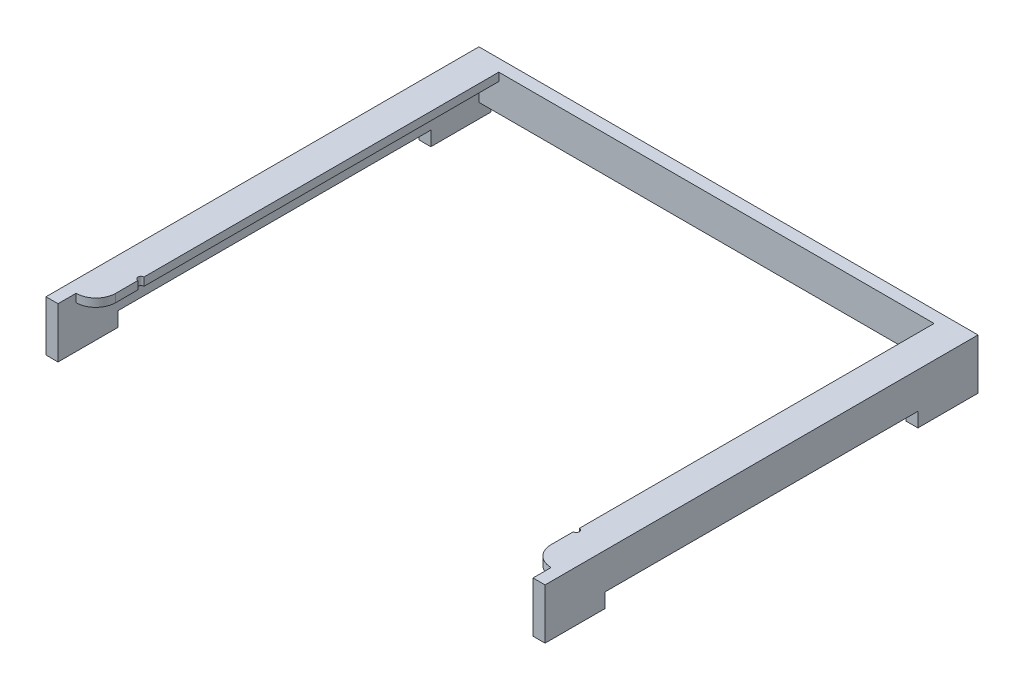
ISO-10303-21;
HEADER;
FILE_DESCRIPTION(('STEP AP214'),'2;1');
FILE_NAME('part.step','',(''),(''),'','','');
FILE_SCHEMA(('AUTOMOTIVE_DESIGN { 1 0 10303 214 1 1 1 1 }'));
ENDSEC;
DATA;
#1=APPLICATION_CONTEXT('core data for automotive mechanical design processes');
#2=APPLICATION_PROTOCOL_DEFINITION('international standard','automotive_design',2000,#1);
#3=PRODUCT_CONTEXT('',#1,'mechanical');
#4=PRODUCT('Part','Part','',(#3));
#5=PRODUCT_RELATED_PRODUCT_CATEGORY('part','',(#4));
#6=PRODUCT_DEFINITION_FORMATION('','',#4);
#7=PRODUCT_DEFINITION_CONTEXT('part definition',#1,'design');
#8=PRODUCT_DEFINITION('design','',#6,#7);
#9=PRODUCT_DEFINITION_SHAPE('','',#8);
#10=(LENGTH_UNIT() NAMED_UNIT(*) SI_UNIT(.MILLI.,.METRE.));
#11=(NAMED_UNIT(*) PLANE_ANGLE_UNIT() SI_UNIT($,.RADIAN.));
#12=(NAMED_UNIT(*) SI_UNIT($,.STERADIAN.) SOLID_ANGLE_UNIT());
#13=UNCERTAINTY_MEASURE_WITH_UNIT(LENGTH_MEASURE(1.E-05),#10,'distance_accuracy_value','');
#14=(GEOMETRIC_REPRESENTATION_CONTEXT(3) GLOBAL_UNCERTAINTY_ASSIGNED_CONTEXT((#13)) GLOBAL_UNIT_ASSIGNED_CONTEXT((#10,
#11,#12)) REPRESENTATION_CONTEXT('',''));
#15=CARTESIAN_POINT('',(0.,0.,0.));
#16=DIRECTION('',(0.,0.,1.));
#17=DIRECTION('',(1.,0.,0.));
#18=AXIS2_PLACEMENT_3D('',#15,#16,#17);
#19=CARTESIAN_POINT('',(0.,0.,0.));
#20=DIRECTION('',(0.,-1.,0.));
#21=DIRECTION('',(0.,0.,-1.));
#22=AXIS2_PLACEMENT_3D('',#19,#20,#21);
#23=PLANE('',#22);
#24=DIRECTION('',(1.,0.,0.));
#25=VECTOR('',#24,1.);
#26=CARTESIAN_POINT('',(83.,0.,-62.));
#27=LINE('',#26,#25);
#28=CARTESIAN_POINT('',(81.,0.,-62.));
#29=VERTEX_POINT('',#28);
#30=CARTESIAN_POINT('',(83.,0.,-62.));
#31=VERTEX_POINT('',#30);
#32=EDGE_CURVE('E303',#29,#31,#27,.T.);
#33=ORIENTED_EDGE('',*,*,#32,.T.);
#34=DIRECTION('',(0.,0.,-1.));
#35=VECTOR('',#34,1.);
#36=CARTESIAN_POINT('',(83.,0.,-72.));
#37=LINE('',#36,#35);
#38=CARTESIAN_POINT('',(83.,0.,-10.));
#39=VERTEX_POINT('',#38);
#40=EDGE_CURVE('E274',#39,#31,#37,.T.);
#41=ORIENTED_EDGE('',*,*,#40,.F.);
#42=DIRECTION('',(-1.,0.,0.));
#43=VECTOR('',#42,1.);
#44=CARTESIAN_POINT('',(83.,0.,-10.));
#45=LINE('',#44,#43);
#46=CARTESIAN_POINT('',(81.,0.,-10.));
#47=VERTEX_POINT('',#46);
#48=EDGE_CURVE('E69',#39,#47,#45,.T.);
#49=ORIENTED_EDGE('',*,*,#48,.T.);
#50=DIRECTION('',(0.,0.,1.));
#51=VECTOR('',#50,1.);
#52=CARTESIAN_POINT('',(81.,0.,0.));
#53=LINE('',#52,#51);
#54=EDGE_CURVE('E528',#29,#47,#53,.T.);
#55=ORIENTED_EDGE('',*,*,#54,.F.);
#56=EDGE_LOOP('',(#33,#41,#49,#55));
#57=FACE_BOUND('',#56,.T.);
#58=ADVANCED_FACE('F40',(#57),#23,.T.);
#59=CARTESIAN_POINT('',(81.,6.,-70.));
#60=DIRECTION('',(0.,0.,-1.));
#61=DIRECTION('',(-1.,0.,0.));
#62=AXIS2_PLACEMENT_3D('',#59,#60,#61);
#63=PLANE('',#62);
#64=DIRECTION('',(0.,1.,0.));
#65=VECTOR('',#64,1.);
#66=CARTESIAN_POINT('',(77.7,4.65,-70.));
#67=LINE('',#66,#65);
#68=CARTESIAN_POINT('',(77.7,4.65,-70.));
#69=VERTEX_POINT('',#68);
#70=CARTESIAN_POINT('',(77.7,6.,-70.));
#71=VERTEX_POINT('',#70);
#72=EDGE_CURVE('E377',#69,#71,#67,.T.);
#73=ORIENTED_EDGE('',*,*,#72,.T.);
#74=DIRECTION('',(1.,0.,0.));
#75=VECTOR('',#74,1.);
#76=CARTESIAN_POINT('',(81.,6.,-70.));
#77=LINE('',#76,#75);
#78=CARTESIAN_POINT('',(5.3,6.,-70.));
#79=VERTEX_POINT('',#78);
#80=EDGE_CURVE('E502',#79,#71,#77,.T.);
#81=ORIENTED_EDGE('',*,*,#80,.F.);
#82=DIRECTION('',(0.,1.,0.));
#83=VECTOR('',#82,1.);
#84=CARTESIAN_POINT('',(5.3,4.65,-70.));
#85=LINE('',#84,#83);
#86=CARTESIAN_POINT('',(5.3,4.65,-70.));
#87=VERTEX_POINT('',#86);
#88=EDGE_CURVE('E481',#87,#79,#85,.T.);
#89=ORIENTED_EDGE('',*,*,#88,.F.);
#90=DIRECTION('',(-1.,0.,0.));
#91=VECTOR('',#90,1.);
#92=CARTESIAN_POINT('',(2.,4.65,-70.));
#93=LINE('',#92,#91);
#94=CARTESIAN_POINT('',(2.,4.65,-70.));
#95=VERTEX_POINT('',#94);
#96=EDGE_CURVE('E454',#87,#95,#93,.T.);
#97=ORIENTED_EDGE('',*,*,#96,.T.);
#98=DIRECTION('',(0.,-1.,0.));
#99=VECTOR('',#98,1.);
#100=CARTESIAN_POINT('',(2.,6.,-70.));
#101=LINE('',#100,#99);
#102=CARTESIAN_POINT('',(2.,0.,-70.));
#103=VERTEX_POINT('',#102);
#104=EDGE_CURVE('E49',#95,#103,#101,.T.);
#105=ORIENTED_EDGE('',*,*,#104,.T.);
#106=DIRECTION('',(1.,0.,0.));
#107=VECTOR('',#106,1.);
#108=CARTESIAN_POINT('',(81.,0.,-70.));
#109=LINE('',#108,#107);
#110=CARTESIAN_POINT('',(81.,0.,-70.));
#111=VERTEX_POINT('',#110);
#112=EDGE_CURVE('E524',#103,#111,#109,.T.);
#113=ORIENTED_EDGE('',*,*,#112,.T.);
#114=DIRECTION('',(0.,-1.,0.));
#115=VECTOR('',#114,1.);
#116=CARTESIAN_POINT('',(81.,6.,-70.));
#117=LINE('',#116,#115);
#118=CARTESIAN_POINT('',(81.,4.65,-70.));
#119=VERTEX_POINT('',#118);
#120=EDGE_CURVE('E549',#119,#111,#117,.T.);
#121=ORIENTED_EDGE('',*,*,#120,.F.);
#122=DIRECTION('',(1.,0.,0.));
#123=VECTOR('',#122,1.);
#124=CARTESIAN_POINT('',(81.,4.65,-70.));
#125=LINE('',#124,#123);
#126=EDGE_CURVE('E341',#69,#119,#125,.T.);
#127=ORIENTED_EDGE('',*,*,#126,.F.);
#128=EDGE_LOOP('',(#73,#81,#89,#97,#105,#113,#121,#127));
#129=FACE_BOUND('',#128,.T.);
#130=ADVANCED_FACE('F555',(#129),#63,.F.);
#131=CARTESIAN_POINT('',(81.,6.,0.));
#132=DIRECTION('',(1.,0.,0.));
#133=DIRECTION('',(0.,0.,-1.));
#134=AXIS2_PLACEMENT_3D('',#131,#132,#133);
#135=PLANE('',#134);
#136=DIRECTION('',(0.,1.,0.));
#137=VECTOR('',#136,1.);
#138=CARTESIAN_POINT('',(81.,4.65,-3.));
#139=LINE('',#138,#137);
#140=CARTESIAN_POINT('',(81.,4.65,-3.));
#141=VERTEX_POINT('',#140);
#142=CARTESIAN_POINT('',(81.,6.,-3.));
#143=VERTEX_POINT('',#142);
#144=EDGE_CURVE('E353',#141,#143,#139,.T.);
#145=ORIENTED_EDGE('',*,*,#144,.F.);
#146=DIRECTION('',(0.,0.,1.));
#147=VECTOR('',#146,1.);
#148=CARTESIAN_POINT('',(81.,4.65,-3.));
#149=LINE('',#148,#147);
#150=EDGE_CURVE('E337',#119,#141,#149,.T.);
#151=ORIENTED_EDGE('',*,*,#150,.F.);
#152=ORIENTED_EDGE('',*,*,#120,.T.);
#153=DIRECTION('',(0.,0.,1.));
#154=VECTOR('',#153,1.);
#155=CARTESIAN_POINT('',(81.,0.,-72.));
#156=LINE('',#155,#154);
#157=CARTESIAN_POINT('',(81.,0.,-72.));
#158=VERTEX_POINT('',#157);
#159=EDGE_CURVE('E59',#158,#111,#156,.T.);
#160=ORIENTED_EDGE('',*,*,#159,.F.);
#161=DIRECTION('',(0.,1.,0.));
#162=VECTOR('',#161,1.);
#163=CARTESIAN_POINT('',(81.,-2.4,-72.));
#164=LINE('',#163,#162);
#165=CARTESIAN_POINT('',(81.,-2.4,-72.));
#166=VERTEX_POINT('',#165);
#167=EDGE_CURVE('E302',#166,#158,#164,.T.);
#168=ORIENTED_EDGE('',*,*,#167,.F.);
#169=DIRECTION('',(0.,0.,1.));
#170=VECTOR('',#169,1.);
#171=CARTESIAN_POINT('',(81.,-2.4,-72.));
#172=LINE('',#171,#170);
#173=CARTESIAN_POINT('',(81.,-2.4,-62.));
#174=VERTEX_POINT('',#173);
#175=EDGE_CURVE('E294',#166,#174,#172,.T.);
#176=ORIENTED_EDGE('',*,*,#175,.T.);
#177=DIRECTION('',(0.,1.,0.));
#178=VECTOR('',#177,1.);
#179=CARTESIAN_POINT('',(81.,-2.4,-62.));
#180=LINE('',#179,#178);
#181=EDGE_CURVE('E280',#174,#29,#180,.T.);
#182=ORIENTED_EDGE('',*,*,#181,.T.);
#183=ORIENTED_EDGE('',*,*,#54,.T.);
#184=DIRECTION('',(0.,1.,0.));
#185=VECTOR('',#184,1.);
#186=CARTESIAN_POINT('',(81.,-2.4,-10.));
#187=LINE('',#186,#185);
#188=CARTESIAN_POINT('',(81.,-2.4,-10.));
#189=VERTEX_POINT('',#188);
#190=EDGE_CURVE('E329',#189,#47,#187,.T.);
#191=ORIENTED_EDGE('',*,*,#190,.F.);
#192=DIRECTION('',(0.,0.,1.));
#193=VECTOR('',#192,1.);
#194=CARTESIAN_POINT('',(81.,-2.4,0.));
#195=LINE('',#194,#193);
#196=CARTESIAN_POINT('',(81.,-2.4,0.));
#197=VERTEX_POINT('',#196);
#198=EDGE_CURVE('E318',#189,#197,#195,.T.);
#199=ORIENTED_EDGE('',*,*,#198,.T.);
#200=DIRECTION('',(0.,-1.,0.));
#201=VECTOR('',#200,1.);
#202=CARTESIAN_POINT('',(81.,6.,0.));
#203=LINE('',#202,#201);
#204=CARTESIAN_POINT('',(81.,6.,0.));
#205=VERTEX_POINT('',#204);
#206=EDGE_CURVE('E547',#205,#197,#203,.T.);
#207=ORIENTED_EDGE('',*,*,#206,.F.);
#208=DIRECTION('',(0.,0.,1.));
#209=VECTOR('',#208,1.);
#210=CARTESIAN_POINT('',(81.,6.,0.));
#211=LINE('',#210,#209);
#212=EDGE_CURVE('E506',#143,#205,#211,.T.);
#213=ORIENTED_EDGE('',*,*,#212,.F.);
#214=EDGE_LOOP('',(#145,#151,#152,#160,#168,#176,#182,#183,#191,#199,#207,#213));
#215=FACE_BOUND('',#214,.T.);
#216=ADVANCED_FACE('F565',(#215),#135,.F.);
#217=ORIENTED_EDGE('',*,*,#159,.T.);
#218=ORIENTED_EDGE('',*,*,#112,.F.);
#219=DIRECTION('',(0.,0.,1.));
#220=VECTOR('',#219,1.);
#221=CARTESIAN_POINT('',(2.,0.,-72.));
#222=LINE('',#221,#220);
#223=CARTESIAN_POINT('',(2.,0.,-72.));
#224=VERTEX_POINT('',#223);
#225=EDGE_CURVE('E368',#224,#103,#222,.T.);
#226=ORIENTED_EDGE('',*,*,#225,.F.);
#227=DIRECTION('',(-1.,0.,0.));
#228=VECTOR('',#227,1.);
#229=CARTESIAN_POINT('',(0.,0.,-72.));
#230=LINE('',#229,#228);
#231=EDGE_CURVE('E533',#158,#224,#230,.T.);
#232=ORIENTED_EDGE('',*,*,#231,.F.);
#233=EDGE_LOOP('',(#217,#218,#226,#232));
#234=FACE_BOUND('',#233,.T.);
#235=ADVANCED_FACE('F561',(#234),#23,.T.);
#236=DIRECTION('',(0.,0.,1.));
#237=VECTOR('',#236,1.);
#238=CARTESIAN_POINT('',(0.,0.,0.));
#239=LINE('',#238,#237);
#240=CARTESIAN_POINT('',(0.,0.,-62.));
#241=VERTEX_POINT('',#240);
#242=CARTESIAN_POINT('',(0.,0.,-10.));
#243=VERTEX_POINT('',#242);
#244=EDGE_CURVE('E498',#241,#243,#239,.T.);
#245=ORIENTED_EDGE('',*,*,#244,.F.);
#246=DIRECTION('',(-1.,0.,0.));
#247=VECTOR('',#246,1.);
#248=CARTESIAN_POINT('',(0.,0.,-62.));
#249=LINE('',#248,#247);
#250=CARTESIAN_POINT('',(2.,0.,-62.));
#251=VERTEX_POINT('',#250);
#252=EDGE_CURVE('E389',#251,#241,#249,.T.);
#253=ORIENTED_EDGE('',*,*,#252,.F.);
#254=DIRECTION('',(0.,0.,-1.));
#255=VECTOR('',#254,1.);
#256=CARTESIAN_POINT('',(2.,0.,-70.));
#257=LINE('',#256,#255);
#258=CARTESIAN_POINT('',(2.,0.,-10.));
#259=VERTEX_POINT('',#258);
#260=EDGE_CURVE('E480',#259,#251,#257,.T.);
#261=ORIENTED_EDGE('',*,*,#260,.F.);
#262=DIRECTION('',(1.,0.,0.));
#263=VECTOR('',#262,1.);
#264=CARTESIAN_POINT('',(0.,0.,-10.));
#265=LINE('',#264,#263);
#266=EDGE_CURVE('E409',#243,#259,#265,.T.);
#267=ORIENTED_EDGE('',*,*,#266,.F.);
#268=EDGE_LOOP('',(#245,#253,#261,#267));
#269=FACE_BOUND('',#268,.T.);
#270=ADVANCED_FACE('F620',(#269),#23,.T.);
#271=CARTESIAN_POINT('',(2.,6.,0.));
#272=DIRECTION('',(0.,0.,-1.));
#273=DIRECTION('',(-1.,0.,0.));
#274=AXIS2_PLACEMENT_3D('',#271,#272,#273);
#275=PLANE('',#274);
#276=DIRECTION('',(0.,-1.,0.));
#277=VECTOR('',#276,1.);
#278=CARTESIAN_POINT('',(0.,6.,0.));
#279=LINE('',#278,#277);
#280=CARTESIAN_POINT('',(0.,6.,0.));
#281=VERTEX_POINT('',#280);
#282=CARTESIAN_POINT('',(0.,-2.4,0.));
#283=VERTEX_POINT('',#282);
#284=EDGE_CURVE('E520',#281,#283,#279,.T.);
#285=ORIENTED_EDGE('',*,*,#284,.T.);
#286=DIRECTION('',(-1.,0.,0.));
#287=VECTOR('',#286,1.);
#288=CARTESIAN_POINT('',(0.,-2.4,0.));
#289=LINE('',#288,#287);
#290=CARTESIAN_POINT('',(2.,-2.4,0.));
#291=VERTEX_POINT('',#290);
#292=EDGE_CURVE('E421',#291,#283,#289,.T.);
#293=ORIENTED_EDGE('',*,*,#292,.F.);
#294=DIRECTION('',(0.,-1.,0.));
#295=VECTOR('',#294,1.);
#296=CARTESIAN_POINT('',(2.,6.,0.));
#297=LINE('',#296,#295);
#298=CARTESIAN_POINT('',(2.,6.,0.));
#299=VERTEX_POINT('',#298);
#300=EDGE_CURVE('E11',#299,#291,#297,.T.);
#301=ORIENTED_EDGE('',*,*,#300,.F.);
#302=DIRECTION('',(1.,0.,0.));
#303=VECTOR('',#302,1.);
#304=CARTESIAN_POINT('',(2.,6.,0.));
#305=LINE('',#304,#303);
#306=EDGE_CURVE('E493',#281,#299,#305,.T.);
#307=ORIENTED_EDGE('',*,*,#306,.F.);
#308=EDGE_LOOP('',(#285,#293,#301,#307));
#309=FACE_BOUND('',#308,.T.);
#310=ADVANCED_FACE('F42',(#309),#275,.F.);
#311=CARTESIAN_POINT('',(2.,6.,-70.));
#312=DIRECTION('',(-1.,0.,0.));
#313=DIRECTION('',(0.,0.,1.));
#314=AXIS2_PLACEMENT_3D('',#311,#312,#313);
#315=PLANE('',#314);
#316=DIRECTION('',(0.,0.,1.));
#317=VECTOR('',#316,1.);
#318=CARTESIAN_POINT('',(2.,4.65,-3.));
#319=LINE('',#318,#317);
#320=CARTESIAN_POINT('',(2.,4.65,-3.));
#321=VERTEX_POINT('',#320);
#322=EDGE_CURVE('E458',#95,#321,#319,.T.);
#323=ORIENTED_EDGE('',*,*,#322,.T.);
#324=DIRECTION('',(0.,1.,0.));
#325=VECTOR('',#324,1.);
#326=CARTESIAN_POINT('',(2.,4.65,-3.));
#327=LINE('',#326,#325);
#328=CARTESIAN_POINT('',(2.,6.,-3.));
#329=VERTEX_POINT('',#328);
#330=EDGE_CURVE('E476',#321,#329,#327,.T.);
#331=ORIENTED_EDGE('',*,*,#330,.T.);
#332=DIRECTION('',(0.,0.,-1.));
#333=VECTOR('',#332,1.);
#334=CARTESIAN_POINT('',(2.,6.,-70.));
#335=LINE('',#334,#333);
#336=EDGE_CURVE('E497',#299,#329,#335,.T.);
#337=ORIENTED_EDGE('',*,*,#336,.F.);
#338=ORIENTED_EDGE('',*,*,#300,.T.);
#339=DIRECTION('',(0.,0.,1.));
#340=VECTOR('',#339,1.);
#341=CARTESIAN_POINT('',(2.,-2.4,0.));
#342=LINE('',#341,#340);
#343=CARTESIAN_POINT('',(2.,-2.4,-10.));
#344=VERTEX_POINT('',#343);
#345=EDGE_CURVE('E417',#344,#291,#342,.T.);
#346=ORIENTED_EDGE('',*,*,#345,.F.);
#347=DIRECTION('',(0.,1.,0.));
#348=VECTOR('',#347,1.);
#349=CARTESIAN_POINT('',(2.,-2.4,-10.));
#350=LINE('',#349,#348);
#351=EDGE_CURVE('E425',#344,#259,#350,.T.);
#352=ORIENTED_EDGE('',*,*,#351,.T.);
#353=ORIENTED_EDGE('',*,*,#260,.T.);
#354=DIRECTION('',(0.,1.,0.));
#355=VECTOR('',#354,1.);
#356=CARTESIAN_POINT('',(2.,-2.4,-62.));
#357=LINE('',#356,#355);
#358=CARTESIAN_POINT('',(2.,-2.4,-62.));
#359=VERTEX_POINT('',#358);
#360=EDGE_CURVE('E403',#359,#251,#357,.T.);
#361=ORIENTED_EDGE('',*,*,#360,.F.);
#362=DIRECTION('',(0.,0.,1.));
#363=VECTOR('',#362,1.);
#364=CARTESIAN_POINT('',(2.,-2.4,-72.));
#365=LINE('',#364,#363);
#366=CARTESIAN_POINT('',(2.,-2.4,-72.));
#367=VERTEX_POINT('',#366);
#368=EDGE_CURVE('E391',#367,#359,#365,.T.);
#369=ORIENTED_EDGE('',*,*,#368,.F.);
#370=DIRECTION('',(0.,1.,0.));
#371=VECTOR('',#370,1.);
#372=CARTESIAN_POINT('',(2.,-2.4,-72.));
#373=LINE('',#372,#371);
#374=EDGE_CURVE('E406',#367,#224,#373,.T.);
#375=ORIENTED_EDGE('',*,*,#374,.T.);
#376=ORIENTED_EDGE('',*,*,#225,.T.);
#377=ORIENTED_EDGE('',*,*,#104,.F.);
#378=EDGE_LOOP('',(#323,#331,#337,#338,#346,#352,#353,#361,#369,#375,#376,#377));
#379=FACE_BOUND('',#378,.T.);
#380=ADVANCED_FACE('F598',(#379),#315,.F.);
#381=CARTESIAN_POINT('',(83.,6.,0.));
#382=DIRECTION('',(0.,0.,-1.));
#383=DIRECTION('',(-1.,0.,0.));
#384=AXIS2_PLACEMENT_3D('',#381,#382,#383);
#385=PLANE('',#384);
#386=ORIENTED_EDGE('',*,*,#206,.T.);
#387=DIRECTION('',(1.,0.,0.));
#388=VECTOR('',#387,1.);
#389=CARTESIAN_POINT('',(83.,-2.4,0.));
#390=LINE('',#389,#388);
#391=CARTESIAN_POINT('',(83.,-2.4,0.));
#392=VERTEX_POINT('',#391);
#393=EDGE_CURVE('E315',#197,#392,#390,.T.);
#394=ORIENTED_EDGE('',*,*,#393,.T.);
#395=DIRECTION('',(0.,-1.,0.));
#396=VECTOR('',#395,1.);
#397=CARTESIAN_POINT('',(83.,6.,0.));
#398=LINE('',#397,#396);
#399=CARTESIAN_POINT('',(83.,6.,0.));
#400=VERTEX_POINT('',#399);
#401=EDGE_CURVE('E545',#400,#392,#398,.T.);
#402=ORIENTED_EDGE('',*,*,#401,.F.);
#403=DIRECTION('',(1.,0.,0.));
#404=VECTOR('',#403,1.);
#405=CARTESIAN_POINT('',(83.,6.,0.));
#406=LINE('',#405,#404);
#407=EDGE_CURVE('E509',#205,#400,#406,.T.);
#408=ORIENTED_EDGE('',*,*,#407,.F.);
#409=EDGE_LOOP('',(#386,#394,#402,#408));
#410=FACE_BOUND('',#409,.T.);
#411=ADVANCED_FACE('F653',(#410),#385,.F.);
#412=CARTESIAN_POINT('',(83.,6.,-72.));
#413=DIRECTION('',(-1.,0.,0.));
#414=DIRECTION('',(0.,0.,1.));
#415=AXIS2_PLACEMENT_3D('',#412,#413,#414);
#416=PLANE('',#415);
#417=ORIENTED_EDGE('',*,*,#401,.T.);
#418=DIRECTION('',(0.,0.,-1.));
#419=VECTOR('',#418,1.);
#420=CARTESIAN_POINT('',(83.,-2.4,0.));
#421=LINE('',#420,#419);
#422=CARTESIAN_POINT('',(83.,-2.4,-10.));
#423=VERTEX_POINT('',#422);
#424=EDGE_CURVE('E312',#392,#423,#421,.T.);
#425=ORIENTED_EDGE('',*,*,#424,.T.);
#426=DIRECTION('',(0.,1.,0.));
#427=VECTOR('',#426,1.);
#428=CARTESIAN_POINT('',(83.,-2.4,-10.));
#429=LINE('',#428,#427);
#430=EDGE_CURVE('E324',#423,#39,#429,.T.);
#431=ORIENTED_EDGE('',*,*,#430,.T.);
#432=ORIENTED_EDGE('',*,*,#40,.T.);
#433=DIRECTION('',(0.,1.,0.));
#434=VECTOR('',#433,1.);
#435=CARTESIAN_POINT('',(83.,-2.4,-62.));
#436=LINE('',#435,#434);
#437=CARTESIAN_POINT('',(83.,-2.4,-62.));
#438=VERTEX_POINT('',#437);
#439=EDGE_CURVE('E267',#438,#31,#436,.T.);
#440=ORIENTED_EDGE('',*,*,#439,.F.);
#441=DIRECTION('',(0.,0.,-1.));
#442=VECTOR('',#441,1.);
#443=CARTESIAN_POINT('',(83.,-2.4,-72.));
#444=LINE('',#443,#442);
#445=CARTESIAN_POINT('',(83.,-2.4,-72.));
#446=VERTEX_POINT('',#445);
#447=EDGE_CURVE('E271',#438,#446,#444,.T.);
#448=ORIENTED_EDGE('',*,*,#447,.T.);
#449=DIRECTION('',(0.,-1.,0.));
#450=VECTOR('',#449,1.);
#451=CARTESIAN_POINT('',(83.,6.,-72.));
#452=LINE('',#451,#450);
#453=CARTESIAN_POINT('',(83.,6.,-72.));
#454=VERTEX_POINT('',#453);
#455=EDGE_CURVE('E542',#454,#446,#452,.T.);
#456=ORIENTED_EDGE('',*,*,#455,.F.);
#457=DIRECTION('',(0.,0.,-1.));
#458=VECTOR('',#457,1.);
#459=CARTESIAN_POINT('',(83.,6.,-72.));
#460=LINE('',#459,#458);
#461=EDGE_CURVE('E511',#400,#454,#460,.T.);
#462=ORIENTED_EDGE('',*,*,#461,.F.);
#463=EDGE_LOOP('',(#417,#425,#431,#432,#440,#448,#456,#462));
#464=FACE_BOUND('',#463,.T.);
#465=ADVANCED_FACE('F269',(#464),#416,.F.);
#466=CARTESIAN_POINT('',(0.,6.,-72.));
#467=DIRECTION('',(0.,0.,1.));
#468=DIRECTION('',(1.,0.,0.));
#469=AXIS2_PLACEMENT_3D('',#466,#467,#468);
#470=PLANE('',#469);
#471=ORIENTED_EDGE('',*,*,#455,.T.);
#472=DIRECTION('',(-1.,0.,0.));
#473=VECTOR('',#472,1.);
#474=CARTESIAN_POINT('',(83.,-2.4,-72.));
#475=LINE('',#474,#473);
#476=EDGE_CURVE('E289',#446,#166,#475,.T.);
#477=ORIENTED_EDGE('',*,*,#476,.T.);
#478=ORIENTED_EDGE('',*,*,#167,.T.);
#479=ORIENTED_EDGE('',*,*,#231,.T.);
#480=ORIENTED_EDGE('',*,*,#374,.F.);
#481=DIRECTION('',(1.,0.,0.));
#482=VECTOR('',#481,1.);
#483=CARTESIAN_POINT('',(0.,-2.4,-72.));
#484=LINE('',#483,#482);
#485=CARTESIAN_POINT('',(0.,-2.4,-72.));
#486=VERTEX_POINT('',#485);
#487=EDGE_CURVE('E388',#486,#367,#484,.T.);
#488=ORIENTED_EDGE('',*,*,#487,.F.);
#489=DIRECTION('',(0.,-1.,0.));
#490=VECTOR('',#489,1.);
#491=CARTESIAN_POINT('',(0.,6.,-72.));
#492=LINE('',#491,#490);
#493=CARTESIAN_POINT('',(0.,6.,-72.));
#494=VERTEX_POINT('',#493);
#495=EDGE_CURVE('E540',#494,#486,#492,.T.);
#496=ORIENTED_EDGE('',*,*,#495,.F.);
#497=DIRECTION('',(-1.,0.,0.));
#498=VECTOR('',#497,1.);
#499=CARTESIAN_POINT('',(0.,6.,-72.));
#500=LINE('',#499,#498);
#501=EDGE_CURVE('E514',#454,#494,#500,.T.);
#502=ORIENTED_EDGE('',*,*,#501,.F.);
#503=EDGE_LOOP('',(#471,#477,#478,#479,#480,#488,#496,#502));
#504=FACE_BOUND('',#503,.T.);
#505=ADVANCED_FACE('F633',(#504),#470,.F.);
#506=CARTESIAN_POINT('',(0.,6.,0.));
#507=DIRECTION('',(1.,0.,0.));
#508=DIRECTION('',(0.,0.,-1.));
#509=AXIS2_PLACEMENT_3D('',#506,#507,#508);
#510=PLANE('',#509);
#511=ORIENTED_EDGE('',*,*,#495,.T.);
#512=DIRECTION('',(0.,0.,-1.));
#513=VECTOR('',#512,1.);
#514=CARTESIAN_POINT('',(0.,-2.4,-72.));
#515=LINE('',#514,#513);
#516=CARTESIAN_POINT('',(0.,-2.4,-62.));
#517=VERTEX_POINT('',#516);
#518=EDGE_CURVE('E384',#517,#486,#515,.T.);
#519=ORIENTED_EDGE('',*,*,#518,.F.);
#520=DIRECTION('',(0.,1.,0.));
#521=VECTOR('',#520,1.);
#522=CARTESIAN_POINT('',(0.,-2.4,-62.));
#523=LINE('',#522,#521);
#524=EDGE_CURVE('E397',#517,#241,#523,.T.);
#525=ORIENTED_EDGE('',*,*,#524,.T.);
#526=ORIENTED_EDGE('',*,*,#244,.T.);
#527=DIRECTION('',(0.,1.,0.));
#528=VECTOR('',#527,1.);
#529=CARTESIAN_POINT('',(0.,-2.4,-10.));
#530=LINE('',#529,#528);
#531=CARTESIAN_POINT('',(0.,-2.4,-10.));
#532=VERTEX_POINT('',#531);
#533=EDGE_CURVE('E432',#532,#243,#530,.T.);
#534=ORIENTED_EDGE('',*,*,#533,.F.);
#535=DIRECTION('',(0.,0.,-1.));
#536=VECTOR('',#535,1.);
#537=CARTESIAN_POINT('',(0.,-2.4,0.));
#538=LINE('',#537,#536);
#539=EDGE_CURVE('E410',#283,#532,#538,.T.);
#540=ORIENTED_EDGE('',*,*,#539,.F.);
#541=ORIENTED_EDGE('',*,*,#284,.F.);
#542=DIRECTION('',(0.,0.,1.));
#543=VECTOR('',#542,1.);
#544=CARTESIAN_POINT('',(0.,6.,0.));
#545=LINE('',#544,#543);
#546=EDGE_CURVE('E517',#494,#281,#545,.T.);
#547=ORIENTED_EDGE('',*,*,#546,.F.);
#548=EDGE_LOOP('',(#511,#519,#525,#526,#534,#540,#541,#547));
#549=FACE_BOUND('',#548,.T.);
#550=ADVANCED_FACE('F626',(#549),#510,.F.);
#551=CARTESIAN_POINT('',(0.,6.,0.));
#552=DIRECTION('',(0.,-1.,0.));
#553=DIRECTION('',(0.,0.,-1.));
#554=AXIS2_PLACEMENT_3D('',#551,#552,#553);
#555=PLANE('',#554);
#556=ORIENTED_EDGE('',*,*,#336,.T.);
#557=CARTESIAN_POINT('',(2.,6.,-6.3));
#558=DIRECTION('',(0.,1.,0.));
#559=DIRECTION('',(0.,0.,1.));
#560=AXIS2_PLACEMENT_3D('',#557,#558,#559);
#561=CIRCLE('',#560,3.3);
#562=CARTESIAN_POINT('',(5.3,6.,-6.3));
#563=VERTEX_POINT('',#562);
#564=EDGE_CURVE('E436',#329,#563,#561,.T.);
#565=ORIENTED_EDGE('',*,*,#564,.T.);
#566=DIRECTION('',(0.,0.,-1.));
#567=VECTOR('',#566,1.);
#568=CARTESIAN_POINT('',(5.3,6.,-6.3));
#569=LINE('',#568,#567);
#570=CARTESIAN_POINT('',(5.3,6.,-10.));
#571=VERTEX_POINT('',#570);
#572=EDGE_CURVE('E466',#563,#571,#569,.T.);
#573=ORIENTED_EDGE('',*,*,#572,.T.);
#574=CARTESIAN_POINT('',(5.3,6.,-10.5));
#575=DIRECTION('',(0.,-1.,0.));
#576=DIRECTION('',(0.,0.,-1.));
#577=AXIS2_PLACEMENT_3D('',#574,#575,#576);
#578=CIRCLE('',#577,0.5);
#579=CARTESIAN_POINT('',(5.3,6.,-11.));
#580=VERTEX_POINT('',#579);
#581=EDGE_CURVE('E470',#571,#580,#578,.T.);
#582=ORIENTED_EDGE('',*,*,#581,.T.);
#583=DIRECTION('',(0.,0.,-1.));
#584=VECTOR('',#583,1.);
#585=CARTESIAN_POINT('',(5.3,6.,-11.));
#586=LINE('',#585,#584);
#587=EDGE_CURVE('E442',#580,#79,#586,.T.);
#588=ORIENTED_EDGE('',*,*,#587,.T.);
#589=ORIENTED_EDGE('',*,*,#80,.T.);
#590=DIRECTION('',(0.,0.,-1.));
#591=VECTOR('',#590,1.);
#592=CARTESIAN_POINT('',(77.7,6.,-11.));
#593=LINE('',#592,#591);
#594=CARTESIAN_POINT('',(77.7,6.,-11.));
#595=VERTEX_POINT('',#594);
#596=EDGE_CURVE('E357',#595,#71,#593,.T.);
#597=ORIENTED_EDGE('',*,*,#596,.F.);
#598=CARTESIAN_POINT('',(77.7,6.,-10.5));
#599=DIRECTION('',(0.,1.,0.));
#600=DIRECTION('',(0.,0.,-1.));
#601=AXIS2_PLACEMENT_3D('',#598,#599,#600);
#602=CIRCLE('',#601,0.5);
#603=CARTESIAN_POINT('',(77.7,6.,-10.));
#604=VERTEX_POINT('',#603);
#605=EDGE_CURVE('E359',#604,#595,#602,.T.);
#606=ORIENTED_EDGE('',*,*,#605,.F.);
#607=DIRECTION('',(0.,0.,-1.));
#608=VECTOR('',#607,1.);
#609=CARTESIAN_POINT('',(77.7,6.,-6.3));
#610=LINE('',#609,#608);
#611=CARTESIAN_POINT('',(77.7,6.,-6.3));
#612=VERTEX_POINT('',#611);
#613=EDGE_CURVE('E338',#612,#604,#610,.T.);
#614=ORIENTED_EDGE('',*,*,#613,.F.);
#615=CARTESIAN_POINT('',(81.,6.,-6.3));
#616=DIRECTION('',(0.,-1.,0.));
#617=DIRECTION('',(0.,0.,1.));
#618=AXIS2_PLACEMENT_3D('',#615,#616,#617);
#619=CIRCLE('',#618,3.3);
#620=EDGE_CURVE('E332',#143,#612,#619,.T.);
#621=ORIENTED_EDGE('',*,*,#620,.F.);
#622=ORIENTED_EDGE('',*,*,#212,.T.);
#623=ORIENTED_EDGE('',*,*,#407,.T.);
#624=ORIENTED_EDGE('',*,*,#461,.T.);
#625=ORIENTED_EDGE('',*,*,#501,.T.);
#626=ORIENTED_EDGE('',*,*,#546,.T.);
#627=ORIENTED_EDGE('',*,*,#306,.T.);
#628=EDGE_LOOP('',(#556,#565,#573,#582,#588,#589,#597,#606,#614,#621,#622,#623,#624,#625,#626,#627));
#629=FACE_BOUND('',#628,.T.);
#630=ADVANCED_FACE('F580',(#629),#555,.F.);
#631=CARTESIAN_POINT('',(2.,4.65,-6.3));
#632=DIRECTION('',(0.,1.,0.));
#633=DIRECTION('',(0.,0.,1.));
#634=AXIS2_PLACEMENT_3D('',#631,#632,#633);
#635=CYLINDRICAL_SURFACE('',#634,3.3);
#636=ORIENTED_EDGE('',*,*,#564,.F.);
#637=ORIENTED_EDGE('',*,*,#330,.F.);
#638=CARTESIAN_POINT('',(2.,4.65,-6.3));
#639=DIRECTION('',(0.,1.,0.));
#640=DIRECTION('',(0.,0.,1.));
#641=AXIS2_PLACEMENT_3D('',#638,#639,#640);
#642=CIRCLE('',#641,3.3);
#643=CARTESIAN_POINT('',(5.3,4.65,-6.3));
#644=VERTEX_POINT('',#643);
#645=EDGE_CURVE('E437',#321,#644,#642,.T.);
#646=ORIENTED_EDGE('',*,*,#645,.T.);
#647=DIRECTION('',(0.,1.,0.));
#648=VECTOR('',#647,1.);
#649=CARTESIAN_POINT('',(5.3,4.65,-6.3));
#650=LINE('',#649,#648);
#651=EDGE_CURVE('E462',#644,#563,#650,.T.);
#652=ORIENTED_EDGE('',*,*,#651,.T.);
#653=EDGE_LOOP('',(#636,#637,#646,#652));
#654=FACE_BOUND('',#653,.T.);
#655=ADVANCED_FACE('F597',(#654),#635,.T.);
#656=CARTESIAN_POINT('',(5.3,4.65,-11.));
#657=DIRECTION('',(1.,0.,0.));
#658=DIRECTION('',(0.,0.,-1.));
#659=AXIS2_PLACEMENT_3D('',#656,#657,#658);
#660=PLANE('',#659);
#661=ORIENTED_EDGE('',*,*,#587,.F.);
#662=DIRECTION('',(0.,1.,0.));
#663=VECTOR('',#662,1.);
#664=CARTESIAN_POINT('',(5.3,4.65,-11.));
#665=LINE('',#664,#663);
#666=CARTESIAN_POINT('',(5.3,4.65,-11.));
#667=VERTEX_POINT('',#666);
#668=EDGE_CURVE('E485',#667,#580,#665,.T.);
#669=ORIENTED_EDGE('',*,*,#668,.F.);
#670=DIRECTION('',(0.,0.,-1.));
#671=VECTOR('',#670,1.);
#672=CARTESIAN_POINT('',(5.3,4.65,-11.));
#673=LINE('',#672,#671);
#674=EDGE_CURVE('E450',#667,#87,#673,.T.);
#675=ORIENTED_EDGE('',*,*,#674,.T.);
#676=ORIENTED_EDGE('',*,*,#88,.T.);
#677=EDGE_LOOP('',(#661,#669,#675,#676));
#678=FACE_BOUND('',#677,.T.);
#679=ADVANCED_FACE('F583',(#678),#660,.T.);
#680=CARTESIAN_POINT('',(5.3,4.65,-10.5));
#681=DIRECTION('',(0.,1.,0.));
#682=DIRECTION('',(0.,0.,1.));
#683=AXIS2_PLACEMENT_3D('',#680,#681,#682);
#684=CYLINDRICAL_SURFACE('',#683,0.5);
#685=ORIENTED_EDGE('',*,*,#581,.F.);
#686=DIRECTION('',(0.,1.,0.));
#687=VECTOR('',#686,1.);
#688=CARTESIAN_POINT('',(5.3,4.65,-10.));
#689=LINE('',#688,#687);
#690=CARTESIAN_POINT('',(5.3,4.65,-10.));
#691=VERTEX_POINT('',#690);
#692=EDGE_CURVE('E488',#691,#571,#689,.T.);
#693=ORIENTED_EDGE('',*,*,#692,.F.);
#694=CARTESIAN_POINT('',(5.3,4.65,-10.5));
#695=DIRECTION('',(0.,-1.,0.));
#696=DIRECTION('',(0.,0.,-1.));
#697=AXIS2_PLACEMENT_3D('',#694,#695,#696);
#698=CIRCLE('',#697,0.5);
#699=EDGE_CURVE('E446',#691,#667,#698,.T.);
#700=ORIENTED_EDGE('',*,*,#699,.T.);
#701=ORIENTED_EDGE('',*,*,#668,.T.);
#702=EDGE_LOOP('',(#685,#693,#700,#701));
#703=FACE_BOUND('',#702,.T.);
#704=ADVANCED_FACE('F592',(#703),#684,.F.);
#705=CARTESIAN_POINT('',(5.3,4.65,-6.3));
#706=DIRECTION('',(1.,0.,0.));
#707=DIRECTION('',(0.,0.,-1.));
#708=AXIS2_PLACEMENT_3D('',#705,#706,#707);
#709=PLANE('',#708);
#710=ORIENTED_EDGE('',*,*,#572,.F.);
#711=ORIENTED_EDGE('',*,*,#651,.F.);
#712=DIRECTION('',(0.,0.,-1.));
#713=VECTOR('',#712,1.);
#714=CARTESIAN_POINT('',(5.3,4.65,-6.3));
#715=LINE('',#714,#713);
#716=EDGE_CURVE('E441',#644,#691,#715,.T.);
#717=ORIENTED_EDGE('',*,*,#716,.T.);
#718=ORIENTED_EDGE('',*,*,#692,.T.);
#719=EDGE_LOOP('',(#710,#711,#717,#718));
#720=FACE_BOUND('',#719,.T.);
#721=ADVANCED_FACE('F595',(#720),#709,.T.);
#722=CARTESIAN_POINT('',(2.,4.65,-6.3));
#723=DIRECTION('',(0.,1.,0.));
#724=DIRECTION('',(0.,0.,1.));
#725=AXIS2_PLACEMENT_3D('',#722,#723,#724);
#726=PLANE('',#725);
#727=ORIENTED_EDGE('',*,*,#645,.F.);
#728=ORIENTED_EDGE('',*,*,#322,.F.);
#729=ORIENTED_EDGE('',*,*,#96,.F.);
#730=ORIENTED_EDGE('',*,*,#674,.F.);
#731=ORIENTED_EDGE('',*,*,#699,.F.);
#732=ORIENTED_EDGE('',*,*,#716,.F.);
#733=EDGE_LOOP('',(#727,#728,#729,#730,#731,#732));
#734=FACE_BOUND('',#733,.T.);
#735=ADVANCED_FACE('F588',(#734),#726,.F.);
#736=CARTESIAN_POINT('',(0.,-2.4,-10.));
#737=DIRECTION('',(0.,0.,1.));
#738=DIRECTION('',(1.,0.,0.));
#739=AXIS2_PLACEMENT_3D('',#736,#737,#738);
#740=PLANE('',#739);
#741=ORIENTED_EDGE('',*,*,#266,.T.);
#742=ORIENTED_EDGE('',*,*,#351,.F.);
#743=DIRECTION('',(1.,0.,0.));
#744=VECTOR('',#743,1.);
#745=CARTESIAN_POINT('',(0.,-2.4,-10.));
#746=LINE('',#745,#744);
#747=EDGE_CURVE('E414',#532,#344,#746,.T.);
#748=ORIENTED_EDGE('',*,*,#747,.F.);
#749=ORIENTED_EDGE('',*,*,#533,.T.);
#750=EDGE_LOOP('',(#741,#742,#748,#749));
#751=FACE_BOUND('',#750,.T.);
#752=ADVANCED_FACE('F612',(#751),#740,.F.);
#753=CARTESIAN_POINT('',(0.,-2.4,0.));
#754=DIRECTION('',(0.,-1.,0.));
#755=DIRECTION('',(0.,0.,-1.));
#756=AXIS2_PLACEMENT_3D('',#753,#754,#755);
#757=PLANE('',#756);
#758=ORIENTED_EDGE('',*,*,#539,.T.);
#759=ORIENTED_EDGE('',*,*,#747,.T.);
#760=ORIENTED_EDGE('',*,*,#345,.T.);
#761=ORIENTED_EDGE('',*,*,#292,.T.);
#762=EDGE_LOOP('',(#758,#759,#760,#761));
#763=FACE_BOUND('',#762,.T.);
#764=ADVANCED_FACE('F607',(#763),#757,.T.);
#765=CARTESIAN_POINT('',(0.,-2.4,-62.));
#766=DIRECTION('',(0.,0.,-1.));
#767=DIRECTION('',(-1.,0.,0.));
#768=AXIS2_PLACEMENT_3D('',#765,#766,#767);
#769=PLANE('',#768);
#770=ORIENTED_EDGE('',*,*,#252,.T.);
#771=ORIENTED_EDGE('',*,*,#524,.F.);
#772=DIRECTION('',(-1.,0.,0.));
#773=VECTOR('',#772,1.);
#774=CARTESIAN_POINT('',(0.,-2.4,-62.));
#775=LINE('',#774,#773);
#776=EDGE_CURVE('E394',#359,#517,#775,.T.);
#777=ORIENTED_EDGE('',*,*,#776,.F.);
#778=ORIENTED_EDGE('',*,*,#360,.T.);
#779=EDGE_LOOP('',(#770,#771,#777,#778));
#780=FACE_BOUND('',#779,.T.);
#781=ADVANCED_FACE('F623',(#780),#769,.F.);
#782=CARTESIAN_POINT('',(0.,-2.4,0.));
#783=DIRECTION('',(0.,1.,0.));
#784=DIRECTION('',(0.,0.,1.));
#785=AXIS2_PLACEMENT_3D('',#782,#783,#784);
#786=PLANE('',#785);
#787=ORIENTED_EDGE('',*,*,#518,.T.);
#788=ORIENTED_EDGE('',*,*,#487,.T.);
#789=ORIENTED_EDGE('',*,*,#368,.T.);
#790=ORIENTED_EDGE('',*,*,#776,.T.);
#791=EDGE_LOOP('',(#787,#788,#789,#790));
#792=FACE_BOUND('',#791,.T.);
#793=ADVANCED_FACE('F630',(#792),#786,.F.);
#794=CARTESIAN_POINT('',(81.,4.65,-6.3));
#795=DIRECTION('',(0.,1.,0.));
#796=DIRECTION('',(0.,0.,1.));
#797=AXIS2_PLACEMENT_3D('',#794,#795,#796);
#798=CYLINDRICAL_SURFACE('',#797,3.3);
#799=ORIENTED_EDGE('',*,*,#620,.T.);
#800=DIRECTION('',(0.,1.,0.));
#801=VECTOR('',#800,1.);
#802=CARTESIAN_POINT('',(77.7,4.65,-6.3));
#803=LINE('',#802,#801);
#804=CARTESIAN_POINT('',(77.7,4.65,-6.3));
#805=VERTEX_POINT('',#804);
#806=EDGE_CURVE('E364',#805,#612,#803,.T.);
#807=ORIENTED_EDGE('',*,*,#806,.F.);
#808=CARTESIAN_POINT('',(81.,4.65,-6.3));
#809=DIRECTION('',(0.,-1.,0.));
#810=DIRECTION('',(0.,0.,1.));
#811=AXIS2_PLACEMENT_3D('',#808,#809,#810);
#812=CIRCLE('',#811,3.3);
#813=EDGE_CURVE('E333',#141,#805,#812,.T.);
#814=ORIENTED_EDGE('',*,*,#813,.F.);
#815=ORIENTED_EDGE('',*,*,#144,.T.);
#816=EDGE_LOOP('',(#799,#807,#814,#815));
#817=FACE_BOUND('',#816,.T.);
#818=ADVANCED_FACE('F761',(#817),#798,.T.);
#819=CARTESIAN_POINT('',(77.7,4.65,-6.3));
#820=DIRECTION('',(1.,0.,0.));
#821=DIRECTION('',(0.,0.,-1.));
#822=AXIS2_PLACEMENT_3D('',#819,#820,#821);
#823=PLANE('',#822);
#824=ORIENTED_EDGE('',*,*,#613,.T.);
#825=DIRECTION('',(0.,1.,0.));
#826=VECTOR('',#825,1.);
#827=CARTESIAN_POINT('',(77.7,4.65,-10.));
#828=LINE('',#827,#826);
#829=CARTESIAN_POINT('',(77.7,4.65,-10.));
#830=VERTEX_POINT('',#829);
#831=EDGE_CURVE('E369',#830,#604,#828,.T.);
#832=ORIENTED_EDGE('',*,*,#831,.F.);
#833=DIRECTION('',(0.,0.,-1.));
#834=VECTOR('',#833,1.);
#835=CARTESIAN_POINT('',(77.7,4.65,-6.3));
#836=LINE('',#835,#834);
#837=EDGE_CURVE('E350',#805,#830,#836,.T.);
#838=ORIENTED_EDGE('',*,*,#837,.F.);
#839=ORIENTED_EDGE('',*,*,#806,.T.);
#840=EDGE_LOOP('',(#824,#832,#838,#839));
#841=FACE_BOUND('',#840,.T.);
#842=ADVANCED_FACE('F765',(#841),#823,.F.);
#843=CARTESIAN_POINT('',(77.7,4.65,-10.5));
#844=DIRECTION('',(0.,1.,0.));
#845=DIRECTION('',(0.,0.,1.));
#846=AXIS2_PLACEMENT_3D('',#843,#844,#845);
#847=CYLINDRICAL_SURFACE('',#846,0.5);
#848=ORIENTED_EDGE('',*,*,#605,.T.);
#849=DIRECTION('',(0.,1.,0.));
#850=VECTOR('',#849,1.);
#851=CARTESIAN_POINT('',(77.7,4.65,-11.));
#852=LINE('',#851,#850);
#853=CARTESIAN_POINT('',(77.7,4.65,-11.));
#854=VERTEX_POINT('',#853);
#855=EDGE_CURVE('E373',#854,#595,#852,.T.);
#856=ORIENTED_EDGE('',*,*,#855,.F.);
#857=CARTESIAN_POINT('',(77.7,4.65,-10.5));
#858=DIRECTION('',(0.,1.,0.));
#859=DIRECTION('',(0.,0.,-1.));
#860=AXIS2_PLACEMENT_3D('',#857,#858,#859);
#861=CIRCLE('',#860,0.5);
#862=EDGE_CURVE('E347',#830,#854,#861,.T.);
#863=ORIENTED_EDGE('',*,*,#862,.F.);
#864=ORIENTED_EDGE('',*,*,#831,.T.);
#865=EDGE_LOOP('',(#848,#856,#863,#864));
#866=FACE_BOUND('',#865,.T.);
#867=ADVANCED_FACE('F776',(#866),#847,.F.);
#868=CARTESIAN_POINT('',(77.7,4.65,-11.));
#869=DIRECTION('',(1.,0.,0.));
#870=DIRECTION('',(0.,0.,-1.));
#871=AXIS2_PLACEMENT_3D('',#868,#869,#870);
#872=PLANE('',#871);
#873=ORIENTED_EDGE('',*,*,#596,.T.);
#874=ORIENTED_EDGE('',*,*,#72,.F.);
#875=DIRECTION('',(0.,0.,-1.));
#876=VECTOR('',#875,1.);
#877=CARTESIAN_POINT('',(77.7,4.65,-11.));
#878=LINE('',#877,#876);
#879=EDGE_CURVE('E344',#854,#69,#878,.T.);
#880=ORIENTED_EDGE('',*,*,#879,.F.);
#881=ORIENTED_EDGE('',*,*,#855,.T.);
#882=EDGE_LOOP('',(#873,#874,#880,#881));
#883=FACE_BOUND('',#882,.T.);
#884=ADVANCED_FACE('F576',(#883),#872,.F.);
#885=CARTESIAN_POINT('',(81.,4.65,-6.3));
#886=DIRECTION('',(0.,1.,0.));
#887=DIRECTION('',(0.,0.,1.));
#888=AXIS2_PLACEMENT_3D('',#885,#886,#887);
#889=PLANE('',#888);
#890=ORIENTED_EDGE('',*,*,#813,.T.);
#891=ORIENTED_EDGE('',*,*,#837,.T.);
#892=ORIENTED_EDGE('',*,*,#862,.T.);
#893=ORIENTED_EDGE('',*,*,#879,.T.);
#894=ORIENTED_EDGE('',*,*,#126,.T.);
#895=ORIENTED_EDGE('',*,*,#150,.T.);
#896=EDGE_LOOP('',(#890,#891,#892,#893,#894,#895));
#897=FACE_BOUND('',#896,.T.);
#898=ADVANCED_FACE('F570',(#897),#889,.F.);
#899=CARTESIAN_POINT('',(83.,-2.4,-10.));
#900=DIRECTION('',(0.,0.,-1.));
#901=DIRECTION('',(-1.,0.,0.));
#902=AXIS2_PLACEMENT_3D('',#899,#900,#901);
#903=PLANE('',#902);
#904=ORIENTED_EDGE('',*,*,#48,.F.);
#905=ORIENTED_EDGE('',*,*,#430,.F.);
#906=DIRECTION('',(-1.,0.,0.));
#907=VECTOR('',#906,1.);
#908=CARTESIAN_POINT('',(83.,-2.4,-10.));
#909=LINE('',#908,#907);
#910=EDGE_CURVE('E321',#423,#189,#909,.T.);
#911=ORIENTED_EDGE('',*,*,#910,.T.);
#912=ORIENTED_EDGE('',*,*,#190,.T.);
#913=EDGE_LOOP('',(#904,#905,#911,#912));
#914=FACE_BOUND('',#913,.T.);
#915=ADVANCED_FACE('F802',(#914),#903,.T.);
#916=CARTESIAN_POINT('',(83.,-2.4,0.));
#917=DIRECTION('',(0.,-1.,0.));
#918=DIRECTION('',(0.,0.,-1.));
#919=AXIS2_PLACEMENT_3D('',#916,#917,#918);
#920=PLANE('',#919);
#921=ORIENTED_EDGE('',*,*,#424,.F.);
#922=ORIENTED_EDGE('',*,*,#393,.F.);
#923=ORIENTED_EDGE('',*,*,#198,.F.);
#924=ORIENTED_EDGE('',*,*,#910,.F.);
#925=EDGE_LOOP('',(#921,#922,#923,#924));
#926=FACE_BOUND('',#925,.T.);
#927=ADVANCED_FACE('F811',(#926),#920,.T.);
#928=CARTESIAN_POINT('',(83.,-2.4,-62.));
#929=DIRECTION('',(0.,0.,1.));
#930=DIRECTION('',(1.,0.,0.));
#931=AXIS2_PLACEMENT_3D('',#928,#929,#930);
#932=PLANE('',#931);
#933=ORIENTED_EDGE('',*,*,#32,.F.);
#934=ORIENTED_EDGE('',*,*,#181,.F.);
#935=DIRECTION('',(1.,0.,0.));
#936=VECTOR('',#935,1.);
#937=CARTESIAN_POINT('',(83.,-2.4,-62.));
#938=LINE('',#937,#936);
#939=EDGE_CURVE('E286',#174,#438,#938,.T.);
#940=ORIENTED_EDGE('',*,*,#939,.T.);
#941=ORIENTED_EDGE('',*,*,#439,.T.);
#942=EDGE_LOOP('',(#933,#934,#940,#941));
#943=FACE_BOUND('',#942,.T.);
#944=ADVANCED_FACE('F292',(#943),#932,.T.);
#945=CARTESIAN_POINT('',(83.,-2.4,0.));
#946=DIRECTION('',(0.,1.,0.));
#947=DIRECTION('',(0.,0.,1.));
#948=AXIS2_PLACEMENT_3D('',#945,#946,#947);
#949=PLANE('',#948);
#950=ORIENTED_EDGE('',*,*,#447,.F.);
#951=ORIENTED_EDGE('',*,*,#939,.F.);
#952=ORIENTED_EDGE('',*,*,#175,.F.);
#953=ORIENTED_EDGE('',*,*,#476,.F.);
#954=EDGE_LOOP('',(#950,#951,#952,#953));
#955=FACE_BOUND('',#954,.T.);
#956=ADVANCED_FACE('F284',(#955),#949,.F.);
#957=CLOSED_SHELL('',(#58,#130,#216,#235,#270,#310,#380,#411,#465,#505,#550,#630,#655,#679,#704,
#721,#735,#752,#764,#781,#793,#818,#842,#867,#884,#898,#915,#927,#944,#956));
#958=MANIFOLD_SOLID_BREP('B2',#957);
#959=ADVANCED_BREP_SHAPE_REPRESENTATION('',(#18,#958),#14);
#960=SHAPE_DEFINITION_REPRESENTATION(#9,#959);
ENDSEC;
END-ISO-10303-21;
